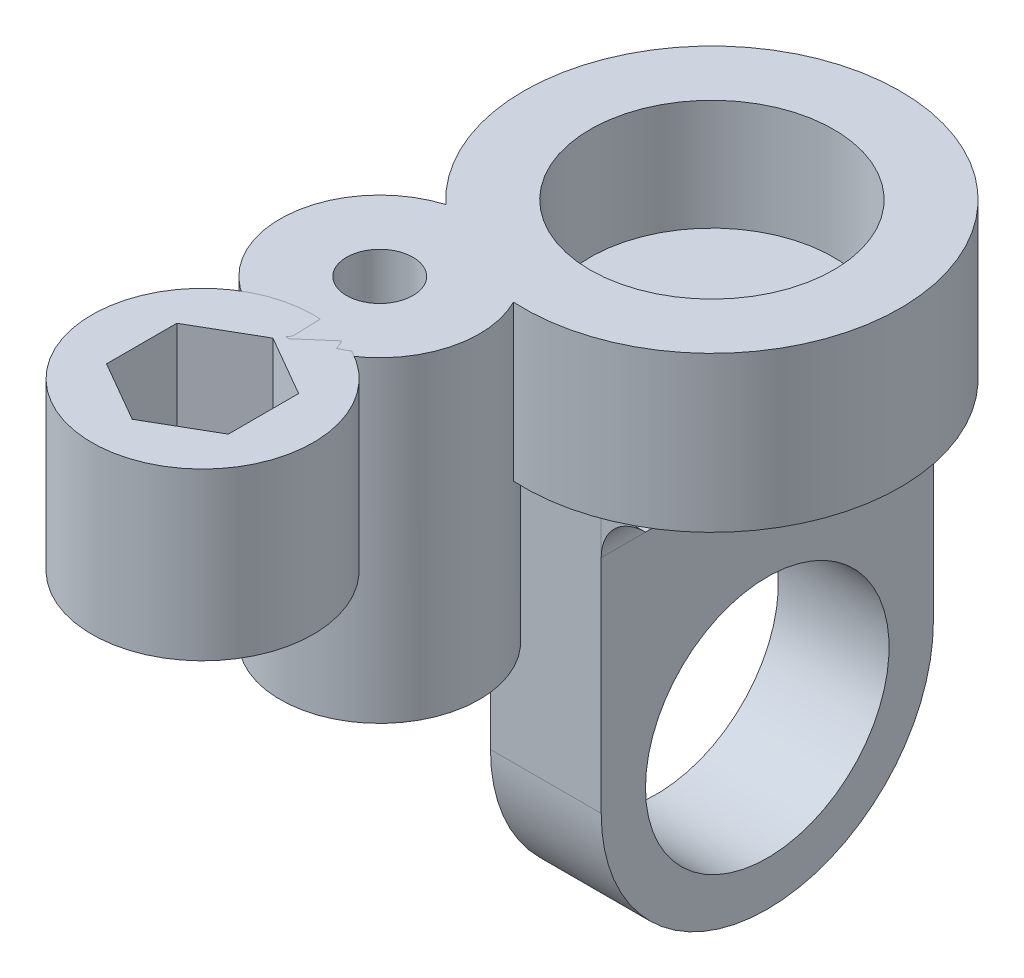
ISO-10303-21;
HEADER;
FILE_DESCRIPTION(('STEP AP214'),'2;1');
FILE_NAME('part.step','',(''),(''),'','','');
FILE_SCHEMA(('AUTOMOTIVE_DESIGN { 1 0 10303 214 1 1 1 1 }'));
ENDSEC;
DATA;
#1=APPLICATION_CONTEXT('core data for automotive mechanical design processes');
#2=APPLICATION_PROTOCOL_DEFINITION('international standard','automotive_design',2000,#1);
#3=PRODUCT_CONTEXT('',#1,'mechanical');
#4=PRODUCT('Part','Part','',(#3));
#5=PRODUCT_RELATED_PRODUCT_CATEGORY('part','',(#4));
#6=PRODUCT_DEFINITION_FORMATION('','',#4);
#7=PRODUCT_DEFINITION_CONTEXT('part definition',#1,'design');
#8=PRODUCT_DEFINITION('design','',#6,#7);
#9=PRODUCT_DEFINITION_SHAPE('','',#8);
#10=(LENGTH_UNIT() NAMED_UNIT(*) SI_UNIT(.MILLI.,.METRE.));
#11=(NAMED_UNIT(*) PLANE_ANGLE_UNIT() SI_UNIT($,.RADIAN.));
#12=(NAMED_UNIT(*) SI_UNIT($,.STERADIAN.) SOLID_ANGLE_UNIT());
#13=UNCERTAINTY_MEASURE_WITH_UNIT(LENGTH_MEASURE(1.E-05),#10,'distance_accuracy_value','');
#14=(GEOMETRIC_REPRESENTATION_CONTEXT(3) GLOBAL_UNCERTAINTY_ASSIGNED_CONTEXT((#13)) GLOBAL_UNIT_ASSIGNED_CONTEXT((#10,
#11,#12)) REPRESENTATION_CONTEXT('',''));
#15=CARTESIAN_POINT('',(0.,0.,0.));
#16=DIRECTION('',(0.,0.,1.));
#17=DIRECTION('',(1.,0.,0.));
#18=AXIS2_PLACEMENT_3D('',#15,#16,#17);
#19=CARTESIAN_POINT('',(-4.49999999999998,-9.00000000000005,7.49999999999922));
#20=DIRECTION('',(0.,0.,-1.));
#21=DIRECTION('',(-1.,0.,0.));
#22=AXIS2_PLACEMENT_3D('',#19,#20,#21);
#23=CYLINDRICAL_SURFACE('',#22,1.99999999999905);
#24=CARTESIAN_POINT('',(-4.50000000000034,-8.99999999999996,-6.00000000000078));
#25=DIRECTION('',(0.,0.,1.));
#26=DIRECTION('',(-1.,0.,0.));
#27=AXIS2_PLACEMENT_3D('',#24,#25,#26);
#28=CIRCLE('',#27,1.99999999999905);
#29=CARTESIAN_POINT('',(-2.50000000000034,-8.99999999999996,-6.00000000000083));
#30=VERTEX_POINT('',#29);
#31=CARTESIAN_POINT('',(-4.50000000000034,-6.99999999999996,-6.00000000000076));
#32=VERTEX_POINT('',#31);
#33=EDGE_CURVE('E94',#30,#32,#28,.T.);
#34=ORIENTED_EDGE('',*,*,#33,.F.);
#35=DIRECTION('',(0.,0.,-1.));
#36=VECTOR('',#35,1.);
#37=CARTESIAN_POINT('',(-2.49999999999998,-9.00000000000005,7.49999999999917));
#38=LINE('',#37,#36);
#39=CARTESIAN_POINT('',(-2.49999999999998,-9.00000000000005,7.49999999999917));
#40=VERTEX_POINT('',#39);
#41=EDGE_CURVE('E48',#40,#30,#38,.T.);
#42=ORIENTED_EDGE('',*,*,#41,.F.);
#43=CARTESIAN_POINT('',(-4.49999999999998,-9.00000000000005,7.49999999999922));
#44=DIRECTION('',(0.,0.,1.));
#45=DIRECTION('',(-1.,0.,0.));
#46=AXIS2_PLACEMENT_3D('',#43,#44,#45);
#47=CIRCLE('',#46,1.99999999999905);
#48=CARTESIAN_POINT('',(-4.49999999999998,-7.00000000000005,7.49999999999923));
#49=VERTEX_POINT('',#48);
#50=EDGE_CURVE('E87',#40,#49,#47,.T.);
#51=ORIENTED_EDGE('',*,*,#50,.T.);
#52=DIRECTION('',(0.,0.,-1.));
#53=VECTOR('',#52,1.);
#54=CARTESIAN_POINT('',(-4.49999999999998,-7.00000000000005,7.49999999999923));
#55=LINE('',#54,#53);
#56=EDGE_CURVE('E12',#49,#32,#55,.T.);
#57=ORIENTED_EDGE('',*,*,#56,.T.);
#58=EDGE_LOOP('',(#34,#42,#51,#57));
#59=FACE_BOUND('',#58,.T.);
#60=ADVANCED_FACE('F45',(#59),#23,.F.);
#61=CARTESIAN_POINT('',(-1.42810132338421E-11,-7.00000000000936,7.49999999999912));
#62=DIRECTION('',(-2.06865774510234E-12,-1.,0.));
#63=DIRECTION('',(-1.,2.06865774510234E-12,0.));
#64=AXIS2_PLACEMENT_3D('',#61,#62,#63);
#65=PLANE('',#64);
#66=DIRECTION('',(1.,-2.06865774510234E-12,0.));
#67=VECTOR('',#66,1.);
#68=CARTESIAN_POINT('',(-1.46399760932791E-11,-7.00000000000927,-6.00000000000088));
#69=LINE('',#68,#67);
#70=CARTESIAN_POINT('',(-2.50000000000034,-7.0000000000041,-6.00000000000082));
#71=VERTEX_POINT('',#70);
#72=EDGE_CURVE('E81',#32,#71,#69,.T.);
#73=ORIENTED_EDGE('',*,*,#72,.F.);
#74=ORIENTED_EDGE('',*,*,#56,.F.);
#75=DIRECTION('',(1.,-2.06865774510234E-12,0.));
#76=VECTOR('',#75,1.);
#77=CARTESIAN_POINT('',(-1.42810132338421E-11,-7.00000000000936,7.49999999999912));
#78=LINE('',#77,#76);
#79=CARTESIAN_POINT('',(-2.49999999999998,-7.00000000000419,7.49999999999918));
#80=VERTEX_POINT('',#79);
#81=EDGE_CURVE('E63',#49,#80,#78,.T.);
#82=ORIENTED_EDGE('',*,*,#81,.T.);
#83=DIRECTION('',(0.,0.,-1.));
#84=VECTOR('',#83,1.);
#85=CARTESIAN_POINT('',(-2.49999999999998,-7.00000000000419,7.49999999999918));
#86=LINE('',#85,#84);
#87=EDGE_CURVE('E54',#80,#71,#86,.T.);
#88=ORIENTED_EDGE('',*,*,#87,.T.);
#89=EDGE_LOOP('',(#73,#74,#82,#88));
#90=FACE_BOUND('',#89,.T.);
#91=ADVANCED_FACE('F109',(#90),#65,.F.);
#92=CARTESIAN_POINT('',(-2.49999999999998,0.,7.49999999999923));
#93=DIRECTION('',(-1.,0.,0.));
#94=DIRECTION('',(0.,0.,1.));
#95=AXIS2_PLACEMENT_3D('',#92,#93,#94);
#96=PLANE('',#95);
#97=DIRECTION('',(0.,-1.,0.));
#98=VECTOR('',#97,1.);
#99=CARTESIAN_POINT('',(-2.50000000000034,0.,-6.00000000000077));
#100=LINE('',#99,#98);
#101=EDGE_CURVE('E76',#71,#30,#100,.T.);
#102=ORIENTED_EDGE('',*,*,#101,.F.);
#103=ORIENTED_EDGE('',*,*,#87,.F.);
#104=DIRECTION('',(0.,-1.,0.));
#105=VECTOR('',#104,1.);
#106=CARTESIAN_POINT('',(-2.49999999999998,0.,7.49999999999923));
#107=LINE('',#106,#105);
#108=EDGE_CURVE('E83',#80,#40,#107,.T.);
#109=ORIENTED_EDGE('',*,*,#108,.T.);
#110=ORIENTED_EDGE('',*,*,#41,.T.);
#111=EDGE_LOOP('',(#102,#103,#109,#110));
#112=FACE_BOUND('',#111,.T.);
#113=ADVANCED_FACE('F84',(#112),#96,.F.);
#114=CARTESIAN_POINT('',(1.99590981893511E-13,0.,7.49999999999916));
#115=DIRECTION('',(0.,0.,-1.));
#116=DIRECTION('',(-1.,0.,0.));
#117=AXIS2_PLACEMENT_3D('',#114,#115,#116);
#118=PLANE('',#117);
#119=ORIENTED_EDGE('',*,*,#50,.F.);
#120=ORIENTED_EDGE('',*,*,#108,.F.);
#121=ORIENTED_EDGE('',*,*,#81,.F.);
#122=EDGE_LOOP('',(#119,#120,#121));
#123=FACE_BOUND('',#122,.T.);
#124=ADVANCED_FACE('F90',(#123),#118,.F.);
#125=CARTESIAN_POINT('',(-1.59371877543417E-13,0.,-6.00000000000084));
#126=DIRECTION('',(0.,0.,-1.));
#127=DIRECTION('',(-1.,0.,0.));
#128=AXIS2_PLACEMENT_3D('',#125,#126,#127);
#129=PLANE('',#128);
#130=ORIENTED_EDGE('',*,*,#33,.T.);
#131=ORIENTED_EDGE('',*,*,#72,.T.);
#132=ORIENTED_EDGE('',*,*,#101,.T.);
#133=EDGE_LOOP('',(#130,#131,#132));
#134=FACE_BOUND('',#133,.T.);
#135=ADVANCED_FACE('F100',(#134),#129,.T.);
#136=CLOSED_SHELL('',(#60,#91,#113,#124,#135));
#137=MANIFOLD_SOLID_BREP('B2',#136);
#138=CARTESIAN_POINT('',(4.50000000000002,-9.00000000000005,7.49999999999898));
#139=DIRECTION('',(0.,0.,-1.));
#140=DIRECTION('',(-1.,0.,0.));
#141=AXIS2_PLACEMENT_3D('',#138,#139,#140);
#142=CYLINDRICAL_SURFACE('',#141,1.99999999999905);
#143=CARTESIAN_POINT('',(4.49999999999966,-8.99999999999996,-6.00000000000102));
#144=DIRECTION('',(0.,0.,1.));
#145=DIRECTION('',(-1.,0.,0.));
#146=AXIS2_PLACEMENT_3D('',#143,#144,#145);
#147=CIRCLE('',#146,1.99999999999905);
#148=CARTESIAN_POINT('',(4.49999999999966,-6.99999999999996,-6.000000000001));
#149=VERTEX_POINT('',#148);
#150=CARTESIAN_POINT('',(2.49999999999966,-8.99999999999996,-6.00000000000096));
#151=VERTEX_POINT('',#150);
#152=EDGE_CURVE('E204',#149,#151,#147,.T.);
#153=ORIENTED_EDGE('',*,*,#152,.F.);
#154=DIRECTION('',(0.,0.,-1.));
#155=VECTOR('',#154,1.);
#156=CARTESIAN_POINT('',(4.50000000000002,-7.00000000000005,7.499999999999));
#157=LINE('',#156,#155);
#158=CARTESIAN_POINT('',(4.50000000000002,-7.00000000000005,7.499999999999));
#159=VERTEX_POINT('',#158);
#160=EDGE_CURVE('E158',#159,#149,#157,.T.);
#161=ORIENTED_EDGE('',*,*,#160,.F.);
#162=CARTESIAN_POINT('',(4.50000000000002,-9.00000000000005,7.49999999999898));
#163=DIRECTION('',(0.,0.,1.));
#164=DIRECTION('',(-1.,0.,0.));
#165=AXIS2_PLACEMENT_3D('',#162,#163,#164);
#166=CIRCLE('',#165,1.99999999999905);
#167=CARTESIAN_POINT('',(2.50000000000002,-9.00000000000005,7.49999999999904));
#168=VERTEX_POINT('',#167);
#169=EDGE_CURVE('E197',#159,#168,#166,.T.);
#170=ORIENTED_EDGE('',*,*,#169,.T.);
#171=DIRECTION('',(0.,0.,-1.));
#172=VECTOR('',#171,1.);
#173=CARTESIAN_POINT('',(2.50000000000002,-9.00000000000005,7.49999999999904));
#174=LINE('',#173,#172);
#175=EDGE_CURVE('E43',#168,#151,#174,.T.);
#176=ORIENTED_EDGE('',*,*,#175,.T.);
#177=EDGE_LOOP('',(#153,#161,#170,#176));
#178=FACE_BOUND('',#177,.T.);
#179=ADVANCED_FACE('F155',(#178),#142,.F.);
#180=CARTESIAN_POINT('',(2.50000000000002,0.,7.49999999999909));
#181=DIRECTION('',(1.,0.,0.));
#182=DIRECTION('',(0.,0.,-1.));
#183=AXIS2_PLACEMENT_3D('',#180,#181,#182);
#184=PLANE('',#183);
#185=DIRECTION('',(0.,1.,0.));
#186=VECTOR('',#185,1.);
#187=CARTESIAN_POINT('',(2.49999999999966,0.,-6.00000000000091));
#188=LINE('',#187,#186);
#189=CARTESIAN_POINT('',(2.49999999999966,-7.0000000000041,-6.00000000000095));
#190=VERTEX_POINT('',#189);
#191=EDGE_CURVE('E191',#151,#190,#188,.T.);
#192=ORIENTED_EDGE('',*,*,#191,.F.);
#193=ORIENTED_EDGE('',*,*,#175,.F.);
#194=DIRECTION('',(0.,1.,0.));
#195=VECTOR('',#194,1.);
#196=CARTESIAN_POINT('',(2.50000000000002,0.,7.49999999999909));
#197=LINE('',#196,#195);
#198=CARTESIAN_POINT('',(2.50000000000002,-7.00000000000419,7.49999999999905));
#199=VERTEX_POINT('',#198);
#200=EDGE_CURVE('E173',#168,#199,#197,.T.);
#201=ORIENTED_EDGE('',*,*,#200,.T.);
#202=DIRECTION('',(0.,0.,-1.));
#203=VECTOR('',#202,1.);
#204=CARTESIAN_POINT('',(2.50000000000002,-7.00000000000419,7.49999999999905));
#205=LINE('',#204,#203);
#206=EDGE_CURVE('E164',#199,#190,#205,.T.);
#207=ORIENTED_EDGE('',*,*,#206,.T.);
#208=EDGE_LOOP('',(#192,#193,#201,#207));
#209=FACE_BOUND('',#208,.T.);
#210=ADVANCED_FACE('F219',(#209),#184,.F.);
#211=CARTESIAN_POINT('',(1.46771594315462E-11,-7.00000000000936,7.49999999999912));
#212=DIRECTION('',(2.06822406423335E-12,-1.,0.));
#213=DIRECTION('',(-1.,-2.06822406423335E-12,0.));
#214=AXIS2_PLACEMENT_3D('',#211,#212,#213);
#215=PLANE('',#214);
#216=DIRECTION('',(1.,2.06822406423335E-12,0.));
#217=VECTOR('',#216,1.);
#218=CARTESIAN_POINT('',(1.43181965721093E-11,-7.00000000000927,-6.00000000000088));
#219=LINE('',#218,#217);
#220=EDGE_CURVE('E186',#190,#149,#219,.T.);
#221=ORIENTED_EDGE('',*,*,#220,.F.);
#222=ORIENTED_EDGE('',*,*,#206,.F.);
#223=DIRECTION('',(1.,2.06822406423335E-12,0.));
#224=VECTOR('',#223,1.);
#225=CARTESIAN_POINT('',(1.46771594315462E-11,-7.00000000000936,7.49999999999912));
#226=LINE('',#225,#224);
#227=EDGE_CURVE('E193',#199,#159,#226,.T.);
#228=ORIENTED_EDGE('',*,*,#227,.T.);
#229=ORIENTED_EDGE('',*,*,#160,.T.);
#230=EDGE_LOOP('',(#221,#222,#228,#229));
#231=FACE_BOUND('',#230,.T.);
#232=ADVANCED_FACE('F194',(#231),#215,.F.);
#233=CARTESIAN_POINT('',(1.99590981893511E-13,0.,7.49999999999916));
#234=DIRECTION('',(0.,0.,-1.));
#235=DIRECTION('',(-1.,0.,0.));
#236=AXIS2_PLACEMENT_3D('',#233,#234,#235);
#237=PLANE('',#236);
#238=ORIENTED_EDGE('',*,*,#169,.F.);
#239=ORIENTED_EDGE('',*,*,#227,.F.);
#240=ORIENTED_EDGE('',*,*,#200,.F.);
#241=EDGE_LOOP('',(#238,#239,#240));
#242=FACE_BOUND('',#241,.T.);
#243=ADVANCED_FACE('F200',(#242),#237,.F.);
#244=CARTESIAN_POINT('',(-1.59371877543417E-13,0.,-6.00000000000084));
#245=DIRECTION('',(0.,0.,-1.));
#246=DIRECTION('',(-1.,0.,0.));
#247=AXIS2_PLACEMENT_3D('',#244,#245,#246);
#248=PLANE('',#247);
#249=ORIENTED_EDGE('',*,*,#152,.T.);
#250=ORIENTED_EDGE('',*,*,#191,.T.);
#251=ORIENTED_EDGE('',*,*,#220,.T.);
#252=EDGE_LOOP('',(#249,#250,#251));
#253=FACE_BOUND('',#252,.T.);
#254=ADVANCED_FACE('F210',(#253),#248,.T.);
#255=CLOSED_SHELL('',(#179,#210,#232,#243,#254));
#256=MANIFOLD_SOLID_BREP('B6',#255);
#257=CARTESIAN_POINT('',(-4.4999999999995,-7.5,18.5));
#258=DIRECTION('',(0.,1.,0.));
#259=DIRECTION('',(0.,0.,-1.));
#260=AXIS2_PLACEMENT_3D('',#257,#258,#259);
#261=CYLINDRICAL_SURFACE('',#260,4.99999999999976);
#262=CARTESIAN_POINT('',(-4.4999999999995,-7.5,18.5));
#263=DIRECTION('',(0.,-1.,0.));
#264=DIRECTION('',(0.,0.,-1.));
#265=AXIS2_PLACEMENT_3D('',#262,#263,#264);
#266=CIRCLE('',#265,4.99999999999976);
#267=CARTESIAN_POINT('',(-4.4999999999995,-7.5,13.5000000000002));
#268=VERTEX_POINT('',#267);
#269=EDGE_CURVE('E153',#268,#268,#266,.T.);
#270=ORIENTED_EDGE('',*,*,#269,.F.);
#271=EDGE_LOOP('',(#270));
#272=FACE_BOUND('',#271,.T.);
#273=CARTESIAN_POINT('',(-4.4999999999995,0.,18.5));
#274=DIRECTION('',(0.,-1.,0.));
#275=DIRECTION('',(0.,0.,-1.));
#276=AXIS2_PLACEMENT_3D('',#273,#274,#275);
#277=CIRCLE('',#276,4.99999999999976);
#278=CARTESIAN_POINT('',(-4.4999999999995,0.,13.5000000000002));
#279=VERTEX_POINT('',#278);
#280=EDGE_CURVE('E267',#279,#279,#277,.T.);
#281=ORIENTED_EDGE('',*,*,#280,.T.);
#282=EDGE_LOOP('',(#281));
#283=FACE_BOUND('',#282,.T.);
#284=ADVANCED_FACE('F264',(#272,#283),#261,.T.);
#285=CARTESIAN_POINT('',(-4.4999999999995,-7.5,18.5));
#286=DIRECTION('',(0.,1.,0.));
#287=DIRECTION('',(0.,0.,-1.));
#288=AXIS2_PLACEMENT_3D('',#285,#286,#287);
#289=PLANE('',#288);
#290=DIRECTION('',(-0.866025403784439,0.,-0.5));
#291=VECTOR('',#290,1.);
#292=CARTESIAN_POINT('',(-4.4999999999995,-7.5,21.6754264805429));
#293=LINE('',#292,#291);
#294=CARTESIAN_POINT('',(-4.4999999999995,-7.5,21.6754264805429));
#295=VERTEX_POINT('',#294);
#296=CARTESIAN_POINT('',(-7.24999999999949,-7.5,20.0877132402714));
#297=VERTEX_POINT('',#296);
#298=EDGE_CURVE('E323',#295,#297,#293,.T.);
#299=ORIENTED_EDGE('',*,*,#298,.F.);
#300=DIRECTION('',(-0.866025403784439,0.,0.5));
#301=VECTOR('',#300,1.);
#302=CARTESIAN_POINT('',(-1.7499999999995,-7.5,20.0877132402714));
#303=LINE('',#302,#301);
#304=CARTESIAN_POINT('',(-1.7499999999995,-7.5,20.0877132402714));
#305=VERTEX_POINT('',#304);
#306=EDGE_CURVE('E344',#305,#295,#303,.T.);
#307=ORIENTED_EDGE('',*,*,#306,.F.);
#308=DIRECTION('',(0.,0.,1.));
#309=VECTOR('',#308,1.);
#310=CARTESIAN_POINT('',(-1.7499999999995,-7.5,16.9122867597285));
#311=LINE('',#310,#309);
#312=CARTESIAN_POINT('',(-1.7499999999995,-7.5,16.9122867597285));
#313=VERTEX_POINT('',#312);
#314=EDGE_CURVE('E339',#313,#305,#311,.T.);
#315=ORIENTED_EDGE('',*,*,#314,.F.);
#316=DIRECTION('',(0.866025403784439,0.,0.5));
#317=VECTOR('',#316,1.);
#318=CARTESIAN_POINT('',(-4.4999999999995,-7.5,15.324573519457));
#319=LINE('',#318,#317);
#320=CARTESIAN_POINT('',(-4.4999999999995,-7.5,15.324573519457));
#321=VERTEX_POINT('',#320);
#322=EDGE_CURVE('E337',#321,#313,#319,.T.);
#323=ORIENTED_EDGE('',*,*,#322,.F.);
#324=DIRECTION('',(0.866025403784438,0.,-0.5));
#325=VECTOR('',#324,1.);
#326=CARTESIAN_POINT('',(-7.24999999999949,-7.5,16.9122867597285));
#327=LINE('',#326,#325);
#328=CARTESIAN_POINT('',(-7.24999999999949,-7.5,16.9122867597285));
#329=VERTEX_POINT('',#328);
#330=EDGE_CURVE('E318',#329,#321,#327,.T.);
#331=ORIENTED_EDGE('',*,*,#330,.F.);
#332=DIRECTION('',(0.,0.,-1.));
#333=VECTOR('',#332,1.);
#334=CARTESIAN_POINT('',(-7.24999999999949,-7.5,20.0877132402714));
#335=LINE('',#334,#333);
#336=EDGE_CURVE('E326',#297,#329,#335,.T.);
#337=ORIENTED_EDGE('',*,*,#336,.F.);
#338=EDGE_LOOP('',(#299,#307,#315,#323,#331,#337));
#339=FACE_BOUND('',#338,.T.);
#340=ORIENTED_EDGE('',*,*,#269,.T.);
#341=EDGE_LOOP('',(#340));
#342=FACE_BOUND('',#341,.T.);
#343=ADVANCED_FACE('F334',(#339,#342),#289,.F.);
#344=CARTESIAN_POINT('',(-4.4999999999995,0.,18.5));
#345=DIRECTION('',(0.,1.,0.));
#346=DIRECTION('',(0.,0.,-1.));
#347=AXIS2_PLACEMENT_3D('',#344,#345,#346);
#348=PLANE('',#347);
#349=DIRECTION('',(0.,0.,-1.));
#350=VECTOR('',#349,1.);
#351=CARTESIAN_POINT('',(-7.24999999999949,0.,20.0877132402714));
#352=LINE('',#351,#350);
#353=CARTESIAN_POINT('',(-7.24999999999949,0.,20.0877132402714));
#354=VERTEX_POINT('',#353);
#355=CARTESIAN_POINT('',(-7.24999999999949,0.,16.9122867597285));
#356=VERTEX_POINT('',#355);
#357=EDGE_CURVE('E348',#354,#356,#352,.T.);
#358=ORIENTED_EDGE('',*,*,#357,.T.);
#359=DIRECTION('',(0.866025403784438,0.,-0.5));
#360=VECTOR('',#359,1.);
#361=CARTESIAN_POINT('',(-7.24999999999949,0.,16.9122867597285));
#362=LINE('',#361,#360);
#363=CARTESIAN_POINT('',(-4.4999999999995,0.,15.324573519457));
#364=VERTEX_POINT('',#363);
#365=EDGE_CURVE('E321',#356,#364,#362,.T.);
#366=ORIENTED_EDGE('',*,*,#365,.T.);
#367=DIRECTION('',(0.866025403784439,0.,0.5));
#368=VECTOR('',#367,1.);
#369=CARTESIAN_POINT('',(-4.4999999999995,0.,15.324573519457));
#370=LINE('',#369,#368);
#371=CARTESIAN_POINT('',(-1.7499999999995,0.,16.9122867597285));
#372=VERTEX_POINT('',#371);
#373=EDGE_CURVE('E351',#364,#372,#370,.T.);
#374=ORIENTED_EDGE('',*,*,#373,.T.);
#375=DIRECTION('',(0.,0.,1.));
#376=VECTOR('',#375,1.);
#377=CARTESIAN_POINT('',(-1.7499999999995,0.,16.9122867597285));
#378=LINE('',#377,#376);
#379=CARTESIAN_POINT('',(-1.7499999999995,0.,20.0877132402714));
#380=VERTEX_POINT('',#379);
#381=EDGE_CURVE('E354',#372,#380,#378,.T.);
#382=ORIENTED_EDGE('',*,*,#381,.T.);
#383=DIRECTION('',(-0.866025403784439,0.,0.5));
#384=VECTOR('',#383,1.);
#385=CARTESIAN_POINT('',(-1.7499999999995,0.,20.0877132402714));
#386=LINE('',#385,#384);
#387=CARTESIAN_POINT('',(-4.4999999999995,0.,21.6754264805429));
#388=VERTEX_POINT('',#387);
#389=EDGE_CURVE('E357',#380,#388,#386,.T.);
#390=ORIENTED_EDGE('',*,*,#389,.T.);
#391=DIRECTION('',(-0.866025403784439,0.,-0.5));
#392=VECTOR('',#391,1.);
#393=CARTESIAN_POINT('',(-4.4999999999995,0.,21.6754264805429));
#394=LINE('',#393,#392);
#395=EDGE_CURVE('E332',#388,#354,#394,.T.);
#396=ORIENTED_EDGE('',*,*,#395,.T.);
#397=EDGE_LOOP('',(#358,#366,#374,#382,#390,#396));
#398=FACE_BOUND('',#397,.T.);
#399=ORIENTED_EDGE('',*,*,#280,.F.);
#400=EDGE_LOOP('',(#399));
#401=FACE_BOUND('',#400,.T.);
#402=ADVANCED_FACE('F372',(#398,#401),#348,.T.);
#403=CARTESIAN_POINT('',(-7.24999999999949,-7.5,20.0877132402714));
#404=DIRECTION('',(-1.,0.,0.));
#405=DIRECTION('',(0.,0.,1.));
#406=AXIS2_PLACEMENT_3D('',#403,#404,#405);
#407=PLANE('',#406);
#408=ORIENTED_EDGE('',*,*,#357,.F.);
#409=DIRECTION('',(0.,1.,0.));
#410=VECTOR('',#409,1.);
#411=CARTESIAN_POINT('',(-7.24999999999949,-7.5,20.0877132402714));
#412=LINE('',#411,#410);
#413=EDGE_CURVE('E328',#297,#354,#412,.T.);
#414=ORIENTED_EDGE('',*,*,#413,.F.);
#415=ORIENTED_EDGE('',*,*,#336,.T.);
#416=DIRECTION('',(0.,1.,0.));
#417=VECTOR('',#416,1.);
#418=CARTESIAN_POINT('',(-7.24999999999949,-7.5,16.9122867597285));
#419=LINE('',#418,#417);
#420=EDGE_CURVE('E286',#329,#356,#419,.T.);
#421=ORIENTED_EDGE('',*,*,#420,.T.);
#422=EDGE_LOOP('',(#408,#414,#415,#421));
#423=FACE_BOUND('',#422,.T.);
#424=ADVANCED_FACE('F327',(#423),#407,.F.);
#425=CARTESIAN_POINT('',(-4.4999999999995,-7.5,21.6754264805429));
#426=DIRECTION('',(-0.5,0.,0.866025403784439));
#427=DIRECTION('',(0.866025403784439,0.,0.5));
#428=AXIS2_PLACEMENT_3D('',#425,#426,#427);
#429=PLANE('',#428);
#430=ORIENTED_EDGE('',*,*,#395,.F.);
#431=DIRECTION('',(0.,1.,0.));
#432=VECTOR('',#431,1.);
#433=CARTESIAN_POINT('',(-4.4999999999995,-7.5,21.6754264805429));
#434=LINE('',#433,#432);
#435=EDGE_CURVE('E363',#295,#388,#434,.T.);
#436=ORIENTED_EDGE('',*,*,#435,.F.);
#437=ORIENTED_EDGE('',*,*,#298,.T.);
#438=ORIENTED_EDGE('',*,*,#413,.T.);
#439=EDGE_LOOP('',(#430,#436,#437,#438));
#440=FACE_BOUND('',#439,.T.);
#441=ADVANCED_FACE('F377',(#440),#429,.F.);
#442=CARTESIAN_POINT('',(-1.7499999999995,-7.5,20.0877132402714));
#443=DIRECTION('',(0.5,0.,0.866025403784438));
#444=DIRECTION('',(0.866025403784439,0.,-0.5));
#445=AXIS2_PLACEMENT_3D('',#442,#443,#444);
#446=PLANE('',#445);
#447=ORIENTED_EDGE('',*,*,#389,.F.);
#448=DIRECTION('',(0.,1.,0.));
#449=VECTOR('',#448,1.);
#450=CARTESIAN_POINT('',(-1.7499999999995,-7.5,20.0877132402714));
#451=LINE('',#450,#449);
#452=EDGE_CURVE('E365',#305,#380,#451,.T.);
#453=ORIENTED_EDGE('',*,*,#452,.F.);
#454=ORIENTED_EDGE('',*,*,#306,.T.);
#455=ORIENTED_EDGE('',*,*,#435,.T.);
#456=EDGE_LOOP('',(#447,#453,#454,#455));
#457=FACE_BOUND('',#456,.T.);
#458=ADVANCED_FACE('F380',(#457),#446,.F.);
#459=CARTESIAN_POINT('',(-1.7499999999995,-7.5,16.9122867597285));
#460=DIRECTION('',(1.,0.,0.));
#461=DIRECTION('',(0.,0.,-1.));
#462=AXIS2_PLACEMENT_3D('',#459,#460,#461);
#463=PLANE('',#462);
#464=ORIENTED_EDGE('',*,*,#381,.F.);
#465=DIRECTION('',(0.,1.,0.));
#466=VECTOR('',#465,1.);
#467=CARTESIAN_POINT('',(-1.7499999999995,-7.5,16.9122867597285));
#468=LINE('',#467,#466);
#469=EDGE_CURVE('E367',#313,#372,#468,.T.);
#470=ORIENTED_EDGE('',*,*,#469,.F.);
#471=ORIENTED_EDGE('',*,*,#314,.T.);
#472=ORIENTED_EDGE('',*,*,#452,.T.);
#473=EDGE_LOOP('',(#464,#470,#471,#472));
#474=FACE_BOUND('',#473,.T.);
#475=ADVANCED_FACE('F382',(#474),#463,.F.);
#476=CARTESIAN_POINT('',(-4.4999999999995,-7.5,15.324573519457));
#477=DIRECTION('',(0.5,0.,-0.866025403784439));
#478=DIRECTION('',(-0.866025403784439,0.,-0.5));
#479=AXIS2_PLACEMENT_3D('',#476,#477,#478);
#480=PLANE('',#479);
#481=ORIENTED_EDGE('',*,*,#373,.F.);
#482=DIRECTION('',(0.,1.,0.));
#483=VECTOR('',#482,1.);
#484=CARTESIAN_POINT('',(-4.4999999999995,-7.5,15.324573519457));
#485=LINE('',#484,#483);
#486=EDGE_CURVE('E278',#321,#364,#485,.T.);
#487=ORIENTED_EDGE('',*,*,#486,.F.);
#488=ORIENTED_EDGE('',*,*,#322,.T.);
#489=ORIENTED_EDGE('',*,*,#469,.T.);
#490=EDGE_LOOP('',(#481,#487,#488,#489));
#491=FACE_BOUND('',#490,.T.);
#492=ADVANCED_FACE('F369',(#491),#480,.F.);
#493=CARTESIAN_POINT('',(-7.24999999999949,-7.5,16.9122867597285));
#494=DIRECTION('',(-0.5,0.,-0.866025403784438));
#495=DIRECTION('',(-0.866025403784439,0.,0.5));
#496=AXIS2_PLACEMENT_3D('',#493,#494,#495);
#497=PLANE('',#496);
#498=ORIENTED_EDGE('',*,*,#365,.F.);
#499=ORIENTED_EDGE('',*,*,#420,.F.);
#500=ORIENTED_EDGE('',*,*,#330,.T.);
#501=ORIENTED_EDGE('',*,*,#486,.T.);
#502=EDGE_LOOP('',(#498,#499,#500,#501));
#503=FACE_BOUND('',#502,.T.);
#504=ADVANCED_FACE('F316',(#503),#497,.F.);
#505=CLOSED_SHELL('',(#284,#343,#402,#424,#441,#458,#475,#492,#504));
#506=MANIFOLD_SOLID_BREP('B37',#505);
#507=CARTESIAN_POINT('',(-4.4999999999995,-25.0279220613613,10.5));
#508=DIRECTION('',(0.,1.,0.));
#509=DIRECTION('',(0.,0.,-1.));
#510=AXIS2_PLACEMENT_3D('',#507,#508,#509);
#511=CYLINDRICAL_SURFACE('',#510,4.49999999999976);
#512=DIRECTION('',(0.,1.,0.));
#513=VECTOR('',#512,1.);
#514=CARTESIAN_POINT('',(-1.14589803375099,-25.0279220613613,7.49999999999903));
#515=LINE('',#514,#513);
#516=CARTESIAN_POINT('',(-1.14589803375155,-14.3000000000041,7.4999999999991));
#517=VERTEX_POINT('',#516);
#518=CARTESIAN_POINT('',(-1.14589803375088,-7.0000000000042,7.49999999999914));
#519=VERTEX_POINT('',#518);
#520=EDGE_CURVE('E570',#517,#519,#515,.T.);
#521=ORIENTED_EDGE('',*,*,#520,.T.);
#522=CARTESIAN_POINT('',(-4.4999999999995,-7.,10.5));
#523=DIRECTION('',(0.,1.,0.));
#524=DIRECTION('',(0.,0.,1.));
#525=AXIS2_PLACEMENT_3D('',#522,#523,#524);
#526=CIRCLE('',#525,4.49999999999976);
#527=CARTESIAN_POINT('',(-0.475502449457192,-7.,8.48668942642302));
#528=VERTEX_POINT('',#527);
#529=EDGE_CURVE('E600',#519,#528,#526,.F.);
#530=ORIENTED_EDGE('',*,*,#529,.T.);
#531=DIRECTION('',(0.,1.,0.));
#532=VECTOR('',#531,1.);
#533=CARTESIAN_POINT('',(-0.475502449457193,-2.50000000000001,8.48668942642302));
#534=LINE('',#533,#532);
#535=CARTESIAN_POINT('',(-0.475502449457193,0.,8.48668942642302));
#536=VERTEX_POINT('',#535);
#537=EDGE_CURVE('E594',#528,#536,#534,.T.);
#538=ORIENTED_EDGE('',*,*,#537,.T.);
#539=CARTESIAN_POINT('',(-4.4999999999995,0.,10.5));
#540=DIRECTION('',(0.,-1.,0.));
#541=DIRECTION('',(0.,0.,-1.));
#542=AXIS2_PLACEMENT_3D('',#539,#540,#541);
#543=CIRCLE('',#542,4.49999999999976);
#544=CARTESIAN_POINT('',(-5.81760099881811,0.,6.1972186195543));
#545=VERTEX_POINT('',#544);
#546=EDGE_CURVE('E586',#536,#545,#543,.T.);
#547=ORIENTED_EDGE('',*,*,#546,.T.);
#548=DIRECTION('',(0.,1.,0.));
#549=VECTOR('',#548,1.);
#550=CARTESIAN_POINT('',(-5.81760099881811,-2.50000000000001,6.1972186195543));
#551=LINE('',#550,#549);
#552=CARTESIAN_POINT('',(-5.81760099881811,-7.,6.1972186195543));
#553=VERTEX_POINT('',#552);
#554=EDGE_CURVE('E597',#545,#553,#551,.F.);
#555=ORIENTED_EDGE('',*,*,#554,.T.);
#556=CARTESIAN_POINT('',(-2.50000000000001,-7.00000000000419,6.46887112585072));
#557=VERTEX_POINT('',#556);
#558=EDGE_CURVE('E601',#553,#557,#526,.F.);
#559=ORIENTED_EDGE('',*,*,#558,.T.);
#560=DIRECTION('',(0.,1.,0.));
#561=VECTOR('',#560,1.);
#562=CARTESIAN_POINT('',(-2.50000000000001,-25.0279220613613,6.46887112585072));
#563=LINE('',#562,#561);
#564=CARTESIAN_POINT('',(-2.50000000000001,-14.3000000000041,6.46887112585124));
#565=VERTEX_POINT('',#564);
#566=EDGE_CURVE('E565',#557,#565,#563,.F.);
#567=ORIENTED_EDGE('',*,*,#566,.T.);
#568=CARTESIAN_POINT('',(-4.4999999999995,-14.3000000000041,10.5));
#569=DIRECTION('',(0.,1.,0.));
#570=DIRECTION('',(0.,0.,1.));
#571=AXIS2_PLACEMENT_3D('',#568,#569,#570);
#572=CIRCLE('',#571,4.49999999999929);
#573=EDGE_CURVE('E577',#565,#517,#572,.T.);
#574=ORIENTED_EDGE('',*,*,#573,.T.);
#575=EDGE_LOOP('',(#521,#530,#538,#547,#555,#559,#567,#574));
#576=FACE_BOUND('',#575,.T.);
#577=ADVANCED_FACE('F456',(#576),#511,.T.);
#578=CARTESIAN_POINT('',(0.,0.,0.));
#579=DIRECTION('',(0.,-1.,0.));
#580=DIRECTION('',(0.,0.,1.));
#581=AXIS2_PLACEMENT_3D('',#578,#579,#580);
#582=PLANE('',#581);
#583=CARTESIAN_POINT('',(0.,0.,0.));
#584=DIRECTION('',(0.,1.,0.));
#585=DIRECTION('',(0.,0.,1.));
#586=AXIS2_PLACEMENT_3D('',#583,#584,#585);
#587=CIRCLE('',#586,8.5);
#588=EDGE_CURVE('E592',#536,#545,#587,.T.);
#589=ORIENTED_EDGE('',*,*,#588,.T.);
#590=ORIENTED_EDGE('',*,*,#546,.F.);
#591=EDGE_LOOP('',(#589,#590));
#592=FACE_BOUND('',#591,.T.);
#593=CARTESIAN_POINT('',(0.,0.,0.));
#594=DIRECTION('',(0.,1.,0.));
#595=DIRECTION('',(0.,0.,1.));
#596=AXIS2_PLACEMENT_3D('',#593,#594,#595);
#597=CIRCLE('',#596,5.5);
#598=CARTESIAN_POINT('',(0.,0.,5.5));
#599=VERTEX_POINT('',#598);
#600=EDGE_CURVE('E589',#599,#599,#597,.T.);
#601=ORIENTED_EDGE('',*,*,#600,.F.);
#602=EDGE_LOOP('',(#601));
#603=FACE_BOUND('',#602,.T.);
#604=CARTESIAN_POINT('',(-4.4999999999995,0.,10.5));
#605=DIRECTION('',(0.,-1.,0.));
#606=DIRECTION('',(0.,0.,-1.));
#607=AXIS2_PLACEMENT_3D('',#604,#605,#606);
#608=CIRCLE('',#607,1.49999999999976);
#609=CARTESIAN_POINT('',(-4.4999999999995,0.,9.00000000000022));
#610=VERTEX_POINT('',#609);
#611=EDGE_CURVE('E583',#610,#610,#608,.T.);
#612=ORIENTED_EDGE('',*,*,#611,.T.);
#613=EDGE_LOOP('',(#612));
#614=FACE_BOUND('',#613,.T.);
#615=ADVANCED_FACE('F619',(#592,#603,#614),#582,.F.);
#616=CARTESIAN_POINT('',(0.,-5.,0.));
#617=DIRECTION('',(0.,1.,0.));
#618=DIRECTION('',(0.,0.,-1.));
#619=AXIS2_PLACEMENT_3D('',#616,#617,#618);
#620=CYLINDRICAL_SURFACE('',#619,8.5);
#621=ORIENTED_EDGE('',*,*,#588,.F.);
#622=ORIENTED_EDGE('',*,*,#537,.F.);
#623=CARTESIAN_POINT('',(0.,-7.,0.));
#624=DIRECTION('',(0.,1.,0.));
#625=DIRECTION('',(0.,0.,1.));
#626=AXIS2_PLACEMENT_3D('',#623,#624,#625);
#627=CIRCLE('',#626,8.5);
#628=EDGE_CURVE('E479',#528,#553,#627,.T.);
#629=ORIENTED_EDGE('',*,*,#628,.T.);
#630=ORIENTED_EDGE('',*,*,#554,.F.);
#631=EDGE_LOOP('',(#621,#622,#629,#630));
#632=FACE_BOUND('',#631,.T.);
#633=ADVANCED_FACE('F458',(#632),#620,.T.);
#634=CARTESIAN_POINT('',(0.,-5.,0.));
#635=DIRECTION('',(0.,1.,0.));
#636=DIRECTION('',(0.,0.,-1.));
#637=AXIS2_PLACEMENT_3D('',#634,#635,#636);
#638=CYLINDRICAL_SURFACE('',#637,5.5);
#639=CARTESIAN_POINT('',(0.,-5.,0.));
#640=DIRECTION('',(0.,1.,0.));
#641=DIRECTION('',(0.,0.,1.));
#642=AXIS2_PLACEMENT_3D('',#639,#640,#641);
#643=CIRCLE('',#642,5.5);
#644=CARTESIAN_POINT('',(0.,-5.,5.5));
#645=VERTEX_POINT('',#644);
#646=EDGE_CURVE('E574',#645,#645,#643,.T.);
#647=ORIENTED_EDGE('',*,*,#646,.F.);
#648=EDGE_LOOP('',(#647));
#649=FACE_BOUND('',#648,.T.);
#650=ORIENTED_EDGE('',*,*,#600,.T.);
#651=EDGE_LOOP('',(#650));
#652=FACE_BOUND('',#651,.T.);
#653=ADVANCED_FACE('F628',(#649,#652),#638,.F.);
#654=CARTESIAN_POINT('',(-4.4999999999995,-25.0279220613613,10.5));
#655=DIRECTION('',(0.,1.,0.));
#656=DIRECTION('',(0.,0.,-1.));
#657=AXIS2_PLACEMENT_3D('',#654,#655,#656);
#658=CYLINDRICAL_SURFACE('',#657,1.49999999999976);
#659=CARTESIAN_POINT('',(-4.4999999999995,-12.3000000000041,10.5));
#660=DIRECTION('',(0.,1.,0.));
#661=DIRECTION('',(0.,0.,1.));
#662=AXIS2_PLACEMENT_3D('',#659,#660,#661);
#663=CIRCLE('',#662,1.49999999999976);
#664=CARTESIAN_POINT('',(-4.4999999999995,-12.3000000000041,9.00000000000022));
#665=VERTEX_POINT('',#664);
#666=EDGE_CURVE('E580',#665,#665,#663,.F.);
#667=CARTESIAN_POINT('',(-4.4999999999995,-12.3000000000041,9.00000000000022));
#668=CARTESIAN_POINT('',(-4.4999999999995,-12.1718750000041,9.00000000000022));
#669=CARTESIAN_POINT('',(-4.4999999999995,-12.043750000004,9.00000000000022));
#670=CARTESIAN_POINT('',(-4.4999999999995,-11.7875000000039,9.00000000000022));
#671=CARTESIAN_POINT('',(-4.4999999999995,-11.6593750000039,9.00000000000022));
#672=CARTESIAN_POINT('',(-4.4999999999995,-11.4031250000038,9.00000000000022));
#673=CARTESIAN_POINT('',(-4.4999999999995,-11.2750000000038,9.00000000000022));
#674=CARTESIAN_POINT('',(-4.4999999999995,-11.0187500000037,9.00000000000022));
#675=CARTESIAN_POINT('',(-4.4999999999995,-10.8906250000036,9.00000000000022));
#676=CARTESIAN_POINT('',(-4.4999999999995,-10.6343750000036,9.00000000000022));
#677=CARTESIAN_POINT('',(-4.4999999999995,-10.5062500000035,9.00000000000022));
#678=CARTESIAN_POINT('',(-4.4999999999995,-10.2500000000034,9.00000000000022));
#679=CARTESIAN_POINT('',(-4.4999999999995,-10.1218750000034,9.00000000000022));
#680=CARTESIAN_POINT('',(-4.4999999999995,-9.86562500000329,9.00000000000022));
#681=CARTESIAN_POINT('',(-4.4999999999995,-9.73750000000325,9.00000000000022));
#682=CARTESIAN_POINT('',(-4.4999999999995,-9.48125000000317,9.00000000000022));
#683=CARTESIAN_POINT('',(-4.4999999999995,-9.35312500000312,9.00000000000022));
#684=CARTESIAN_POINT('',(-4.4999999999995,-9.09687500000304,9.00000000000022));
#685=CARTESIAN_POINT('',(-4.4999999999995,-8.968750000003,9.00000000000022));
#686=CARTESIAN_POINT('',(-4.4999999999995,-8.71250000000291,9.00000000000022));
#687=CARTESIAN_POINT('',(-4.4999999999995,-8.58437500000287,9.00000000000022));
#688=CARTESIAN_POINT('',(-4.4999999999995,-8.32812500000278,9.00000000000022));
#689=CARTESIAN_POINT('',(-4.4999999999995,-8.20000000000274,9.00000000000022));
#690=CARTESIAN_POINT('',(-4.4999999999995,-7.94375000000265,9.00000000000022));
#691=CARTESIAN_POINT('',(-4.4999999999995,-7.81562500000261,9.00000000000022));
#692=CARTESIAN_POINT('',(-4.4999999999995,-7.55937500000253,9.00000000000022));
#693=CARTESIAN_POINT('',(-4.4999999999995,-7.43125000000248,9.00000000000022));
#694=CARTESIAN_POINT('',(-4.4999999999995,-7.1750000000024,9.00000000000022));
#695=CARTESIAN_POINT('',(-4.4999999999995,-7.04687500000235,9.00000000000022));
#696=CARTESIAN_POINT('',(-4.4999999999995,-6.79062500000227,9.00000000000022));
#697=CARTESIAN_POINT('',(-4.4999999999995,-6.66250000000222,9.00000000000022));
#698=CARTESIAN_POINT('',(-4.4999999999995,-6.40625000000214,9.00000000000022));
#699=CARTESIAN_POINT('',(-4.4999999999995,-6.2781250000021,9.00000000000022));
#700=CARTESIAN_POINT('',(-4.4999999999995,-6.02187500000201,9.00000000000022));
#701=CARTESIAN_POINT('',(-4.4999999999995,-5.89375000000197,9.00000000000022));
#702=CARTESIAN_POINT('',(-4.4999999999995,-5.63750000000188,9.00000000000022));
#703=CARTESIAN_POINT('',(-4.4999999999995,-5.50937500000184,9.00000000000022));
#704=CARTESIAN_POINT('',(-4.4999999999995,-5.25312500000175,9.00000000000022));
#705=CARTESIAN_POINT('',(-4.4999999999995,-5.12500000000171,9.00000000000022));
#706=CARTESIAN_POINT('',(-4.4999999999995,-4.86875000000162,9.00000000000022));
#707=CARTESIAN_POINT('',(-4.4999999999995,-4.74062500000158,9.00000000000022));
#708=CARTESIAN_POINT('',(-4.4999999999995,-4.4843750000015,9.00000000000022));
#709=CARTESIAN_POINT('',(-4.4999999999995,-4.35625000000145,9.00000000000022));
#710=CARTESIAN_POINT('',(-4.4999999999995,-4.10000000000137,9.00000000000022));
#711=CARTESIAN_POINT('',(-4.4999999999995,-3.97187500000132,9.00000000000022));
#712=CARTESIAN_POINT('',(-4.4999999999995,-3.71562500000124,9.00000000000022));
#713=CARTESIAN_POINT('',(-4.4999999999995,-3.5875000000012,9.00000000000022));
#714=CARTESIAN_POINT('',(-4.4999999999995,-3.33125000000111,9.00000000000022));
#715=CARTESIAN_POINT('',(-4.4999999999995,-3.20312500000107,9.00000000000022));
#716=CARTESIAN_POINT('',(-4.4999999999995,-2.94687500000098,9.00000000000022));
#717=CARTESIAN_POINT('',(-4.4999999999995,-2.81875000000094,9.00000000000022));
#718=CARTESIAN_POINT('',(-4.4999999999995,-2.56250000000085,9.00000000000022));
#719=CARTESIAN_POINT('',(-4.4999999999995,-2.43437500000081,9.00000000000022));
#720=CARTESIAN_POINT('',(-4.4999999999995,-2.17812500000073,9.00000000000022));
#721=CARTESIAN_POINT('',(-4.4999999999995,-2.05000000000068,9.00000000000022));
#722=CARTESIAN_POINT('',(-4.4999999999995,-1.7937500000006,9.00000000000022));
#723=CARTESIAN_POINT('',(-4.4999999999995,-1.66562500000055,9.00000000000022));
#724=CARTESIAN_POINT('',(-4.4999999999995,-1.40937500000047,9.00000000000022));
#725=CARTESIAN_POINT('',(-4.4999999999995,-1.28125000000043,9.00000000000022));
#726=CARTESIAN_POINT('',(-4.4999999999995,-1.02500000000034,9.00000000000022));
#727=CARTESIAN_POINT('',(-4.4999999999995,-0.896875000000296,9.00000000000022));
#728=CARTESIAN_POINT('',(-4.4999999999995,-0.640625000000209,9.00000000000022));
#729=CARTESIAN_POINT('',(-4.4999999999995,-0.512500000000167,9.00000000000022));
#730=CARTESIAN_POINT('',(-4.4999999999995,-0.256250000000082,9.00000000000022));
#731=CARTESIAN_POINT('',(-4.4999999999995,-0.128125000000039,9.00000000000022));
#732=CARTESIAN_POINT('',(-4.4999999999995,0.,9.00000000000022));
#733=B_SPLINE_CURVE_WITH_KNOTS('',3,(#667,#668,#669,#670,#671,#672,#673,#674,#675,#676,#677,
#678,#679,#680,#681,#682,#683,#684,#685,#686,#687,#688,#689,#690,#691,#692,#693,#694,#695,#696,
#697,#698,#699,#700,#701,#702,#703,#704,#705,#706,#707,#708,#709,#710,#711,#712,#713,#714,#715,
#716,#717,#718,#719,#720,#721,#722,#723,#724,#725,#726,#727,#728,#729,#730,#731,#732),
.UNSPECIFIED.,.F.,.F.,(4,2,2,2,2,2,2,2,2,2,2,2,2,2,2,2,2,2,2,2,2,2,2,2,2,2,2,2,2,2,2,2,4),(0.,
0.384375000000128,0.768750000000257,1.15312500000039,1.53750000000051,1.92187500000064,
2.30625000000077,2.6906250000009,3.07500000000103,3.45937500000115,3.84375000000128,
4.22812500000141,4.61250000000154,4.99687500000167,5.3812500000018,5.76562500000193,
6.15000000000205,6.53437500000218,6.91875000000231,7.30312500000244,7.68750000000257,
8.0718750000027,8.45625000000283,8.84062500000296,9.22500000000308,9.60937500000321,
9.99375000000334,10.3781250000035,10.7625000000036,11.1468750000037,11.5312500000039,
11.915625000004,12.3000000000041),.UNSPECIFIED.);
#734=EDGE_CURVE('BSEAM626',#665,#610,#733,.T.);
#735=ORIENTED_EDGE('',*,*,#666,.T.);
#736=ORIENTED_EDGE('',*,*,#611,.F.);
#737=ORIENTED_EDGE('',*,*,#734,.T.);
#738=ORIENTED_EDGE('',*,*,#734,.F.);
#739=EDGE_LOOP('',(#735,#737,#736,#738));
#740=FACE_BOUND('',#739,.T.);
#741=ADVANCED_FACE('F626',(#740),#658,.F.);
#742=CARTESIAN_POINT('',(-4.4999999999995,-14.3000000000041,10.5));
#743=DIRECTION('',(0.,-1.,0.));
#744=DIRECTION('',(0.,0.,1.));
#745=AXIS2_PLACEMENT_3D('',#742,#743,#744);
#746=PLANE('',#745);
#747=DIRECTION('',(1.,0.,0.));
#748=VECTOR('',#747,1.);
#749=CARTESIAN_POINT('',(-4.49999999999958,-14.3000000000041,7.49999999999919));
#750=LINE('',#749,#748);
#751=CARTESIAN_POINT('',(-2.49999999999998,-14.3000000000041,7.49999999999913));
#752=VERTEX_POINT('',#751);
#753=EDGE_CURVE('E568',#752,#517,#750,.T.);
#754=ORIENTED_EDGE('',*,*,#753,.T.);
#755=ORIENTED_EDGE('',*,*,#573,.F.);
#756=DIRECTION('',(0.,0.,1.));
#757=VECTOR('',#756,1.);
#758=CARTESIAN_POINT('',(-2.4999999999999,-14.3000000000041,10.4999999999999));
#759=LINE('',#758,#757);
#760=EDGE_CURVE('E540',#565,#752,#759,.T.);
#761=ORIENTED_EDGE('',*,*,#760,.T.);
#762=EDGE_LOOP('',(#754,#755,#761));
#763=FACE_BOUND('',#762,.T.);
#764=ADVANCED_FACE('F614',(#763),#746,.T.);
#765=CARTESIAN_POINT('',(-4.4999999999995,-12.3000000000041,10.5));
#766=DIRECTION('',(0.,-1.,0.));
#767=DIRECTION('',(0.,0.,1.));
#768=AXIS2_PLACEMENT_3D('',#765,#766,#767);
#769=PLANE('',#768);
#770=ORIENTED_EDGE('',*,*,#666,.F.);
#771=EDGE_LOOP('',(#770));
#772=FACE_BOUND('',#771,.T.);
#773=ADVANCED_FACE('F635',(#772),#769,.F.);
#774=CARTESIAN_POINT('',(0.,-7.,0.));
#775=DIRECTION('',(0.,-1.,0.));
#776=DIRECTION('',(0.,0.,1.));
#777=AXIS2_PLACEMENT_3D('',#774,#775,#776);
#778=PLANE('',#777);
#779=DIRECTION('',(0.,0.,1.));
#780=VECTOR('',#779,1.);
#781=CARTESIAN_POINT('',(-2.50000000000018,-7.,0.));
#782=LINE('',#781,#780);
#783=CARTESIAN_POINT('',(-2.50000000000038,-7.00000000000409,-7.50000000000082));
#784=VERTEX_POINT('',#783);
#785=EDGE_CURVE('E262',#784,#557,#782,.T.);
#786=ORIENTED_EDGE('',*,*,#785,.T.);
#787=ORIENTED_EDGE('',*,*,#558,.F.);
#788=ORIENTED_EDGE('',*,*,#628,.F.);
#789=ORIENTED_EDGE('',*,*,#529,.F.);
#790=DIRECTION('',(1.,0.,0.));
#791=VECTOR('',#790,1.);
#792=CARTESIAN_POINT('',(1.9942381079827E-13,-7.,7.49999999999912));
#793=LINE('',#792,#791);
#794=CARTESIAN_POINT('',(2.50000000000002,-7.,7.49999999999905));
#795=VERTEX_POINT('',#794);
#796=EDGE_CURVE('E464',#519,#795,#793,.T.);
#797=ORIENTED_EDGE('',*,*,#796,.T.);
#798=DIRECTION('',(0.,0.,-1.));
#799=VECTOR('',#798,1.);
#800=CARTESIAN_POINT('',(2.49999999999982,-7.00000000000414,-1.18285011415298E-13));
#801=LINE('',#800,#799);
#802=CARTESIAN_POINT('',(2.49999999999962,-7.00000000000409,-7.50000000000095));
#803=VERTEX_POINT('',#802);
#804=EDGE_CURVE('E557',#795,#803,#801,.T.);
#805=ORIENTED_EDGE('',*,*,#804,.T.);
#806=DIRECTION('',(1.,0.,0.));
#807=VECTOR('',#806,1.);
#808=CARTESIAN_POINT('',(-2.50000000000038,-7.00000000000409,-7.50000000000082));
#809=LINE('',#808,#807);
#810=EDGE_CURVE('E541',#784,#803,#809,.T.);
#811=ORIENTED_EDGE('',*,*,#810,.F.);
#812=EDGE_LOOP('',(#786,#787,#788,#789,#797,#805,#811));
#813=FACE_BOUND('',#812,.T.);
#814=ADVANCED_FACE('F606',(#813),#778,.T.);
#815=CARTESIAN_POINT('',(0.,-5.,0.));
#816=DIRECTION('',(0.,-1.,0.));
#817=DIRECTION('',(0.,0.,1.));
#818=AXIS2_PLACEMENT_3D('',#815,#816,#817);
#819=PLANE('',#818);
#820=ORIENTED_EDGE('',*,*,#646,.T.);
#821=EDGE_LOOP('',(#820));
#822=FACE_BOUND('',#821,.T.);
#823=ADVANCED_FACE('F686',(#822),#819,.F.);
#824=CARTESIAN_POINT('',(-2.50000000000018,-19.0000000000041,-8.98253693648598E-13));
#825=DIRECTION('',(1.,0.,0.));
#826=DIRECTION('',(0.,0.,-1.));
#827=AXIS2_PLACEMENT_3D('',#824,#825,#826);
#828=CYLINDRICAL_SURFACE('',#827,7.5);
#829=CARTESIAN_POINT('',(2.49999999999982,-19.0000000000041,-1.03120290084746E-12));
#830=DIRECTION('',(1.,0.,0.));
#831=DIRECTION('',(0.,0.,1.));
#832=AXIS2_PLACEMENT_3D('',#829,#830,#831);
#833=CIRCLE('',#832,7.5);
#834=CARTESIAN_POINT('',(2.50000000000002,-19.0000000000042,7.49999999999897));
#835=VERTEX_POINT('',#834);
#836=CARTESIAN_POINT('',(2.49999999999962,-19.0000000000041,-7.50000000000103));
#837=VERTEX_POINT('',#836);
#838=EDGE_CURVE('E554',#835,#837,#833,.T.);
#839=ORIENTED_EDGE('',*,*,#838,.F.);
#840=DIRECTION('',(1.,0.,0.));
#841=VECTOR('',#840,1.);
#842=CARTESIAN_POINT('',(-2.49999999999998,-19.0000000000042,7.4999999999991));
#843=LINE('',#842,#841);
#844=CARTESIAN_POINT('',(-2.49999999999998,-19.0000000000042,7.4999999999991));
#845=VERTEX_POINT('',#844);
#846=EDGE_CURVE('E544',#845,#835,#843,.T.);
#847=ORIENTED_EDGE('',*,*,#846,.F.);
#848=CARTESIAN_POINT('',(-2.50000000000018,-19.0000000000041,-8.98253693648598E-13));
#849=DIRECTION('',(1.,0.,0.));
#850=DIRECTION('',(0.,0.,1.));
#851=AXIS2_PLACEMENT_3D('',#848,#849,#850);
#852=CIRCLE('',#851,7.5);
#853=CARTESIAN_POINT('',(-2.50000000000038,-19.0000000000041,-7.5000000000009));
#854=VERTEX_POINT('',#853);
#855=EDGE_CURVE('E525',#845,#854,#852,.T.);
#856=ORIENTED_EDGE('',*,*,#855,.T.);
#857=DIRECTION('',(1.,0.,0.));
#858=VECTOR('',#857,1.);
#859=CARTESIAN_POINT('',(-2.50000000000038,-19.0000000000041,-7.5000000000009));
#860=LINE('',#859,#858);
#861=EDGE_CURVE('E534',#854,#837,#860,.T.);
#862=ORIENTED_EDGE('',*,*,#861,.T.);
#863=EDGE_LOOP('',(#839,#847,#856,#862));
#864=FACE_BOUND('',#863,.T.);
#865=ADVANCED_FACE('F543',(#864),#828,.T.);
#866=CARTESIAN_POINT('',(-2.50000000000038,0.,-7.50000000000077));
#867=DIRECTION('',(0.,0.,-1.));
#868=DIRECTION('',(-1.,0.,0.));
#869=AXIS2_PLACEMENT_3D('',#866,#867,#868);
#870=PLANE('',#869);
#871=DIRECTION('',(0.,-1.,0.));
#872=VECTOR('',#871,1.);
#873=CARTESIAN_POINT('',(2.49999999999962,0.,-7.5000000000009));
#874=LINE('',#873,#872);
#875=EDGE_CURVE('E536',#803,#837,#874,.T.);
#876=ORIENTED_EDGE('',*,*,#875,.T.);
#877=ORIENTED_EDGE('',*,*,#861,.F.);
#878=DIRECTION('',(0.,-1.,0.));
#879=VECTOR('',#878,1.);
#880=CARTESIAN_POINT('',(-2.50000000000038,0.,-7.50000000000077));
#881=LINE('',#880,#879);
#882=EDGE_CURVE('E521',#784,#854,#881,.T.);
#883=ORIENTED_EDGE('',*,*,#882,.F.);
#884=ORIENTED_EDGE('',*,*,#810,.T.);
#885=EDGE_LOOP('',(#876,#877,#883,#884));
#886=FACE_BOUND('',#885,.T.);
#887=ADVANCED_FACE('F535',(#886),#870,.T.);
#888=CARTESIAN_POINT('',(-2.50000000000018,-19.0000000000041,-8.98253693648598E-13));
#889=DIRECTION('',(1.,0.,0.));
#890=DIRECTION('',(0.,0.,-1.));
#891=AXIS2_PLACEMENT_3D('',#888,#889,#890);
#892=CYLINDRICAL_SURFACE('',#891,5.5);
#893=CARTESIAN_POINT('',(-2.50000000000018,-19.0000000000041,-8.98253693648598E-13));
#894=DIRECTION('',(1.,0.,0.));
#895=DIRECTION('',(0.,0.,1.));
#896=AXIS2_PLACEMENT_3D('',#893,#894,#895);
#897=CIRCLE('',#896,5.5);
#898=CARTESIAN_POINT('',(-2.50000000000003,-19.0000000000041,5.4999999999991));
#899=VERTEX_POINT('',#898);
#900=EDGE_CURVE('E545',#899,#899,#897,.T.);
#901=ORIENTED_EDGE('',*,*,#900,.F.);
#902=EDGE_LOOP('',(#901));
#903=FACE_BOUND('',#902,.T.);
#904=CARTESIAN_POINT('',(2.49999999999982,-19.0000000000041,-1.03120290084746E-12));
#905=DIRECTION('',(1.,0.,0.));
#906=DIRECTION('',(0.,0.,1.));
#907=AXIS2_PLACEMENT_3D('',#904,#905,#906);
#908=CIRCLE('',#907,5.5);
#909=CARTESIAN_POINT('',(2.49999999999997,-19.0000000000041,5.49999999999897));
#910=VERTEX_POINT('',#909);
#911=EDGE_CURVE('E551',#910,#910,#908,.T.);
#912=ORIENTED_EDGE('',*,*,#911,.T.);
#913=EDGE_LOOP('',(#912));
#914=FACE_BOUND('',#913,.T.);
#915=ADVANCED_FACE('F712',(#903,#914),#892,.F.);
#916=CARTESIAN_POINT('',(-2.49999999999998,0.,7.49999999999923));
#917=DIRECTION('',(0.,0.,1.));
#918=DIRECTION('',(1.,0.,0.));
#919=AXIS2_PLACEMENT_3D('',#916,#917,#918);
#920=PLANE('',#919);
#921=ORIENTED_EDGE('',*,*,#753,.F.);
#922=DIRECTION('',(0.,1.,0.));
#923=VECTOR('',#922,1.);
#924=CARTESIAN_POINT('',(-2.49999999999998,0.,7.49999999999923));
#925=LINE('',#924,#923);
#926=EDGE_CURVE('E531',#845,#752,#925,.T.);
#927=ORIENTED_EDGE('',*,*,#926,.F.);
#928=ORIENTED_EDGE('',*,*,#846,.T.);
#929=DIRECTION('',(0.,1.,0.));
#930=VECTOR('',#929,1.);
#931=CARTESIAN_POINT('',(2.50000000000002,0.,7.49999999999909));
#932=LINE('',#931,#930);
#933=EDGE_CURVE('E471',#835,#795,#932,.T.);
#934=ORIENTED_EDGE('',*,*,#933,.T.);
#935=ORIENTED_EDGE('',*,*,#796,.F.);
#936=ORIENTED_EDGE('',*,*,#520,.F.);
#937=EDGE_LOOP('',(#921,#927,#928,#934,#935,#936));
#938=FACE_BOUND('',#937,.T.);
#939=ADVANCED_FACE('F610',(#938),#920,.T.);
#940=CARTESIAN_POINT('',(-2.50000000000018,0.,0.));
#941=DIRECTION('',(-1.,0.,0.));
#942=DIRECTION('',(0.,0.,1.));
#943=AXIS2_PLACEMENT_3D('',#940,#941,#942);
#944=PLANE('',#943);
#945=ORIENTED_EDGE('',*,*,#900,.T.);
#946=EDGE_LOOP('',(#945));
#947=FACE_BOUND('',#946,.T.);
#948=ORIENTED_EDGE('',*,*,#785,.F.);
#949=ORIENTED_EDGE('',*,*,#882,.T.);
#950=ORIENTED_EDGE('',*,*,#855,.F.);
#951=ORIENTED_EDGE('',*,*,#926,.T.);
#952=ORIENTED_EDGE('',*,*,#760,.F.);
#953=ORIENTED_EDGE('',*,*,#566,.F.);
#954=EDGE_LOOP('',(#948,#949,#950,#951,#952,#953));
#955=FACE_BOUND('',#954,.T.);
#956=ADVANCED_FACE('F523',(#947,#955),#944,.T.);
#957=CARTESIAN_POINT('',(2.49999999999982,0.,0.));
#958=DIRECTION('',(-1.,0.,0.));
#959=DIRECTION('',(0.,0.,1.));
#960=AXIS2_PLACEMENT_3D('',#957,#958,#959);
#961=PLANE('',#960);
#962=ORIENTED_EDGE('',*,*,#911,.F.);
#963=EDGE_LOOP('',(#962));
#964=FACE_BOUND('',#963,.T.);
#965=ORIENTED_EDGE('',*,*,#838,.T.);
#966=ORIENTED_EDGE('',*,*,#875,.F.);
#967=ORIENTED_EDGE('',*,*,#804,.F.);
#968=ORIENTED_EDGE('',*,*,#933,.F.);
#969=EDGE_LOOP('',(#965,#966,#967,#968));
#970=FACE_BOUND('',#969,.T.);
#971=ADVANCED_FACE('F616',(#964,#970),#961,.F.);
#972=CLOSED_SHELL('',(#577,#615,#633,#653,#741,#764,#773,#814,#823,#865,#887,#915,#939,#956,#971));
#973=MANIFOLD_SOLID_BREP('B147',#972);
#974=ADVANCED_BREP_SHAPE_REPRESENTATION('',(#18,#137,#256,#506,#973),#14);
#975=SHAPE_DEFINITION_REPRESENTATION(#9,#974);
ENDSEC;
END-ISO-10303-21;
